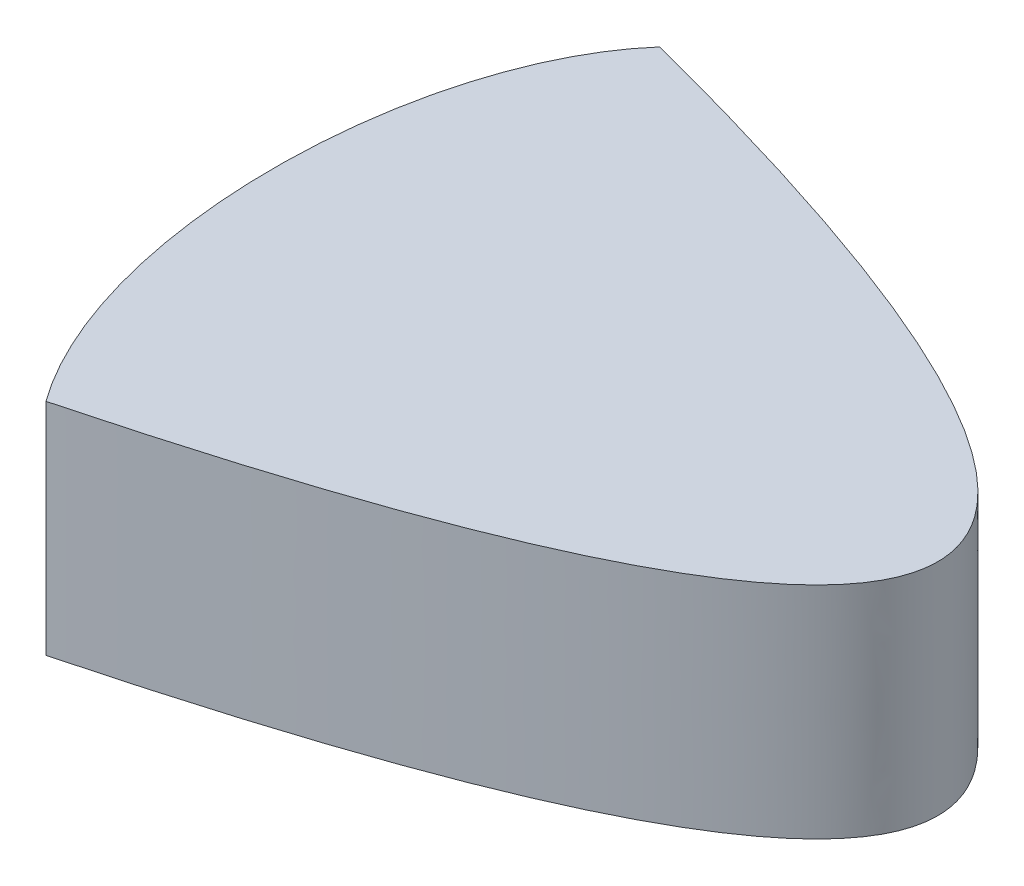
ISO-10303-21;
HEADER;
FILE_DESCRIPTION(('STEP AP214'),'2;1');
FILE_NAME('part.step','',(''),(''),'','','');
FILE_SCHEMA(('AUTOMOTIVE_DESIGN { 1 0 10303 214 1 1 1 1 }'));
ENDSEC;
DATA;
#1=APPLICATION_CONTEXT('core data for automotive mechanical design processes');
#2=APPLICATION_PROTOCOL_DEFINITION('international standard','automotive_design',2000,#1);
#3=PRODUCT_CONTEXT('',#1,'mechanical');
#4=PRODUCT('Part','Part','',(#3));
#5=PRODUCT_RELATED_PRODUCT_CATEGORY('part','',(#4));
#6=PRODUCT_DEFINITION_FORMATION('','',#4);
#7=PRODUCT_DEFINITION_CONTEXT('part definition',#1,'design');
#8=PRODUCT_DEFINITION('design','',#6,#7);
#9=PRODUCT_DEFINITION_SHAPE('','',#8);
#10=(LENGTH_UNIT() NAMED_UNIT(*) SI_UNIT(.MILLI.,.METRE.));
#11=(NAMED_UNIT(*) PLANE_ANGLE_UNIT() SI_UNIT($,.RADIAN.));
#12=(NAMED_UNIT(*) SI_UNIT($,.STERADIAN.) SOLID_ANGLE_UNIT());
#13=UNCERTAINTY_MEASURE_WITH_UNIT(LENGTH_MEASURE(1.E-05),#10,'distance_accuracy_value','');
#14=(GEOMETRIC_REPRESENTATION_CONTEXT(3) GLOBAL_UNCERTAINTY_ASSIGNED_CONTEXT((#13)) GLOBAL_UNIT_ASSIGNED_CONTEXT((#10,
#11,#12)) REPRESENTATION_CONTEXT('',''));
#15=CARTESIAN_POINT('',(0.,0.,0.));
#16=DIRECTION('',(0.,0.,1.));
#17=DIRECTION('',(1.,0.,0.));
#18=AXIS2_PLACEMENT_3D('',#15,#16,#17);
#19=CARTESIAN_POINT('',(-54.0363656247546,10.,-30.75));
#20=DIRECTION('',(0.,1.,0.));
#21=DIRECTION('',(0.,0.,1.));
#22=AXIS2_PLACEMENT_3D('',#19,#20,#21);
#23=PLANE('',#22);
#24=CARTESIAN_POINT('',(-86.5,10.,-13.95));
#25=CARTESIAN_POINT('',(-91.7174686370063,10.,-8.04051707789676));
#26=CARTESIAN_POINT('',(-91.9617677291297,10.,6.4227765229776));
#27=CARTESIAN_POINT('',(-86.5,10.,13.95));
#28=B_SPLINE_CURVE_WITH_KNOTS('',3,(#24,#25,#26,#27),.UNSPECIFIED.,.F.,.F.,(4,4),(0.,1.),.UNSPECIFIED.);
#29=CARTESIAN_POINT('',(-86.5,10.,-13.95));
#30=VERTEX_POINT('',#29);
#31=CARTESIAN_POINT('',(-86.5,10.,13.95));
#32=VERTEX_POINT('',#31);
#33=EDGE_CURVE('E64',#30,#32,#28,.T.);
#34=ORIENTED_EDGE('',*,*,#33,.T.);
#35=CARTESIAN_POINT('',(-86.5,10.,13.95));
#36=CARTESIAN_POINT('',(-33.3474120057159,10.,0.));
#37=CARTESIAN_POINT('',(-86.5,10.,-13.95));
#38=B_SPLINE_CURVE_WITH_KNOTS('',2,(#35,#36,#37),.UNSPECIFIED.,.F.,.F.,(3,3),(0.,1.),.UNSPECIFIED.);
#39=EDGE_CURVE('E55',#32,#30,#38,.T.);
#40=ORIENTED_EDGE('',*,*,#39,.T.);
#41=EDGE_LOOP('',(#34,#40));
#42=FACE_BOUND('',#41,.T.);
#43=ADVANCED_FACE('F32',(#42),#23,.T.);
#44=CARTESIAN_POINT('',(-86.5,-0.25,13.95));
#45=CARTESIAN_POINT('',(-33.3474120057159,-0.25,0.));
#46=CARTESIAN_POINT('',(-86.5,-0.25,-13.95));
#47=B_SPLINE_CURVE_WITH_KNOTS('',2,(#44,#45,#46),.UNSPECIFIED.,.F.,.F.,(3,3),(0.,1.),.UNSPECIFIED.);
#48=DIRECTION('',(0.,1.,0.));
#49=VECTOR('',#48,1.);
#50=SURFACE_OF_LINEAR_EXTRUSION('',#47,#49);
#51=CARTESIAN_POINT('',(-86.5,0.,13.95));
#52=CARTESIAN_POINT('',(-33.3474120057159,0.,0.));
#53=CARTESIAN_POINT('',(-86.5,0.,-13.95));
#54=B_SPLINE_CURVE_WITH_KNOTS('',2,(#51,#52,#53),.UNSPECIFIED.,.F.,.F.,(3,3),(0.,1.),.UNSPECIFIED.);
#55=CARTESIAN_POINT('',(-86.5,0.,13.95));
#56=VERTEX_POINT('',#55);
#57=CARTESIAN_POINT('',(-86.5,0.,-13.95));
#58=VERTEX_POINT('',#57);
#59=EDGE_CURVE('E11',#56,#58,#54,.T.);
#60=ORIENTED_EDGE('',*,*,#59,.T.);
#61=DIRECTION('',(0.,1.,0.));
#62=VECTOR('',#61,1.);
#63=CARTESIAN_POINT('',(-86.5,-0.25,-13.95));
#64=LINE('',#63,#62);
#65=EDGE_CURVE('E49',#58,#30,#64,.T.);
#66=ORIENTED_EDGE('',*,*,#65,.T.);
#67=ORIENTED_EDGE('',*,*,#39,.F.);
#68=DIRECTION('',(0.,1.,0.));
#69=VECTOR('',#68,1.);
#70=CARTESIAN_POINT('',(-86.5,-0.25,13.95));
#71=LINE('',#70,#69);
#72=EDGE_CURVE('E63',#56,#32,#71,.T.);
#73=ORIENTED_EDGE('',*,*,#72,.F.);
#74=EDGE_LOOP('',(#60,#66,#67,#73));
#75=FACE_BOUND('',#74,.T.);
#76=ADVANCED_FACE('F60',(#75),#50,.T.);
#77=CARTESIAN_POINT('',(-86.5,-0.25,-13.95));
#78=CARTESIAN_POINT('',(-91.7174686370063,-0.25,-8.04051707789676));
#79=CARTESIAN_POINT('',(-91.9617677291297,-0.25,6.4227765229776));
#80=CARTESIAN_POINT('',(-86.5,-0.25,13.95));
#81=B_SPLINE_CURVE_WITH_KNOTS('',3,(#77,#78,#79,#80),.UNSPECIFIED.,.F.,.F.,(4,4),(0.,1.),.UNSPECIFIED.);
#82=DIRECTION('',(0.,1.,0.));
#83=VECTOR('',#82,1.);
#84=SURFACE_OF_LINEAR_EXTRUSION('',#81,#83);
#85=CARTESIAN_POINT('',(-86.5,0.,-13.95));
#86=CARTESIAN_POINT('',(-91.7174686370063,0.,-8.04051707789676));
#87=CARTESIAN_POINT('',(-91.9617677291297,0.,6.4227765229776));
#88=CARTESIAN_POINT('',(-86.5,0.,13.95));
#89=B_SPLINE_CURVE_WITH_KNOTS('',3,(#85,#86,#87,#88),.UNSPECIFIED.,.F.,.F.,(4,4),(0.,1.),.UNSPECIFIED.);
#90=EDGE_CURVE('E42',#58,#56,#89,.T.);
#91=ORIENTED_EDGE('',*,*,#90,.T.);
#92=ORIENTED_EDGE('',*,*,#72,.T.);
#93=ORIENTED_EDGE('',*,*,#33,.F.);
#94=ORIENTED_EDGE('',*,*,#65,.F.);
#95=EDGE_LOOP('',(#91,#92,#93,#94));
#96=FACE_BOUND('',#95,.T.);
#97=ADVANCED_FACE('F67',(#96),#84,.T.);
#98=CARTESIAN_POINT('',(-54.0363656247546,0.,-30.75));
#99=DIRECTION('',(0.,1.,0.));
#100=DIRECTION('',(0.,0.,1.));
#101=AXIS2_PLACEMENT_3D('',#98,#99,#100);
#102=PLANE('',#101);
#103=ORIENTED_EDGE('',*,*,#59,.F.);
#104=ORIENTED_EDGE('',*,*,#90,.F.);
#105=EDGE_LOOP('',(#103,#104));
#106=FACE_BOUND('',#105,.T.);
#107=ADVANCED_FACE('F34',(#106),#102,.F.);
#108=CLOSED_SHELL('',(#43,#76,#97,#107));
#109=MANIFOLD_SOLID_BREP('B2',#108);
#110=ADVANCED_BREP_SHAPE_REPRESENTATION('',(#18,#109),#14);
#111=SHAPE_DEFINITION_REPRESENTATION(#9,#110);
ENDSEC;
END-ISO-10303-21;
